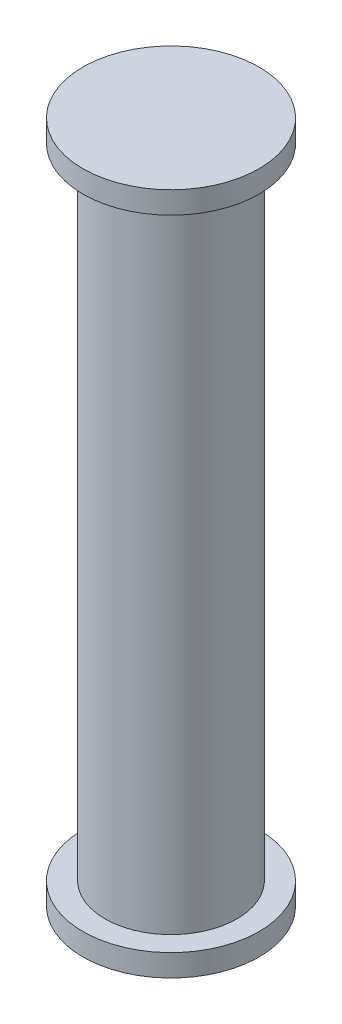
ISO-10303-21;
HEADER;
FILE_DESCRIPTION(('STEP AP214'),'2;1');
FILE_NAME('part.step','',(''),(''),'','','');
FILE_SCHEMA(('AUTOMOTIVE_DESIGN { 1 0 10303 214 1 1 1 1 }'));
ENDSEC;
DATA;
#1=APPLICATION_CONTEXT('core data for automotive mechanical design processes');
#2=APPLICATION_PROTOCOL_DEFINITION('international standard','automotive_design',2000,#1);
#3=PRODUCT_CONTEXT('',#1,'mechanical');
#4=PRODUCT('Part','Part','',(#3));
#5=PRODUCT_RELATED_PRODUCT_CATEGORY('part','',(#4));
#6=PRODUCT_DEFINITION_FORMATION('','',#4);
#7=PRODUCT_DEFINITION_CONTEXT('part definition',#1,'design');
#8=PRODUCT_DEFINITION('design','',#6,#7);
#9=PRODUCT_DEFINITION_SHAPE('','',#8);
#10=(LENGTH_UNIT() NAMED_UNIT(*) SI_UNIT(.MILLI.,.METRE.));
#11=(NAMED_UNIT(*) PLANE_ANGLE_UNIT() SI_UNIT($,.RADIAN.));
#12=(NAMED_UNIT(*) SI_UNIT($,.STERADIAN.) SOLID_ANGLE_UNIT());
#13=UNCERTAINTY_MEASURE_WITH_UNIT(LENGTH_MEASURE(1.E-05),#10,'distance_accuracy_value','');
#14=(GEOMETRIC_REPRESENTATION_CONTEXT(3) GLOBAL_UNCERTAINTY_ASSIGNED_CONTEXT((#13)) GLOBAL_UNIT_ASSIGNED_CONTEXT((#10,
#11,#12)) REPRESENTATION_CONTEXT('',''));
#15=CARTESIAN_POINT('',(0.,0.,0.));
#16=DIRECTION('',(0.,0.,1.));
#17=DIRECTION('',(1.,0.,0.));
#18=AXIS2_PLACEMENT_3D('',#15,#16,#17);
#19=CARTESIAN_POINT('',(0.,-30.,0.));
#20=DIRECTION('',(0.,1.,0.));
#21=DIRECTION('',(0.,0.,1.));
#22=AXIS2_PLACEMENT_3D('',#19,#20,#21);
#23=CYLINDRICAL_SURFACE('',#22,3.);
#24=CARTESIAN_POINT('',(0.,-30.,0.));
#25=DIRECTION('',(0.,1.,0.));
#26=DIRECTION('',(0.,0.,1.));
#27=AXIS2_PLACEMENT_3D('',#24,#25,#26);
#28=CIRCLE('',#27,3.);
#29=CARTESIAN_POINT('',(0.,-30.,3.));
#30=VERTEX_POINT('',#29);
#31=EDGE_CURVE('E52',#30,#30,#28,.T.);
#32=ORIENTED_EDGE('',*,*,#31,.T.);
#33=EDGE_LOOP('',(#32));
#34=FACE_BOUND('',#33,.T.);
#35=CARTESIAN_POINT('',(0.,-1.,0.));
#36=DIRECTION('',(0.,1.,0.));
#37=DIRECTION('',(0.,0.,1.));
#38=AXIS2_PLACEMENT_3D('',#35,#36,#37);
#39=CIRCLE('',#38,3.);
#40=CARTESIAN_POINT('',(0.,-1.,3.));
#41=VERTEX_POINT('',#40);
#42=EDGE_CURVE('E10',#41,#41,#39,.F.);
#43=ORIENTED_EDGE('',*,*,#42,.T.);
#44=EDGE_LOOP('',(#43));
#45=FACE_BOUND('',#44,.T.);
#46=ADVANCED_FACE('F37',(#34,#45),#23,.T.);
#47=CARTESIAN_POINT('',(0.,-1.,0.));
#48=DIRECTION('',(0.,1.,0.));
#49=DIRECTION('',(0.,0.,1.));
#50=AXIS2_PLACEMENT_3D('',#47,#48,#49);
#51=CYLINDRICAL_SURFACE('',#50,4.);
#52=CARTESIAN_POINT('',(0.,-1.,0.));
#53=DIRECTION('',(0.,1.,0.));
#54=DIRECTION('',(0.,0.,1.));
#55=AXIS2_PLACEMENT_3D('',#52,#53,#54);
#56=CIRCLE('',#55,4.);
#57=CARTESIAN_POINT('',(0.,-1.,4.));
#58=VERTEX_POINT('',#57);
#59=EDGE_CURVE('E43',#58,#58,#56,.T.);
#60=ORIENTED_EDGE('',*,*,#59,.T.);
#61=EDGE_LOOP('',(#60));
#62=FACE_BOUND('',#61,.T.);
#63=CARTESIAN_POINT('',(0.,0.,0.));
#64=DIRECTION('',(0.,1.,0.));
#65=DIRECTION('',(0.,0.,1.));
#66=AXIS2_PLACEMENT_3D('',#63,#64,#65);
#67=CIRCLE('',#66,4.);
#68=CARTESIAN_POINT('',(0.,0.,4.));
#69=VERTEX_POINT('',#68);
#70=EDGE_CURVE('E47',#69,#69,#67,.T.);
#71=ORIENTED_EDGE('',*,*,#70,.F.);
#72=EDGE_LOOP('',(#71));
#73=FACE_BOUND('',#72,.T.);
#74=ADVANCED_FACE('F80',(#62,#73),#51,.T.);
#75=CARTESIAN_POINT('',(0.,-1.,0.));
#76=DIRECTION('',(0.,1.,0.));
#77=DIRECTION('',(0.,0.,1.));
#78=AXIS2_PLACEMENT_3D('',#75,#76,#77);
#79=PLANE('',#78);
#80=ORIENTED_EDGE('',*,*,#42,.F.);
#81=EDGE_LOOP('',(#80));
#82=FACE_BOUND('',#81,.T.);
#83=ORIENTED_EDGE('',*,*,#59,.F.);
#84=EDGE_LOOP('',(#83));
#85=FACE_BOUND('',#84,.T.);
#86=ADVANCED_FACE('F84',(#82,#85),#79,.F.);
#87=CARTESIAN_POINT('',(0.,0.,0.));
#88=DIRECTION('',(0.,1.,0.));
#89=DIRECTION('',(0.,0.,1.));
#90=AXIS2_PLACEMENT_3D('',#87,#88,#89);
#91=PLANE('',#90);
#92=ORIENTED_EDGE('',*,*,#70,.T.);
#93=EDGE_LOOP('',(#92));
#94=FACE_BOUND('',#93,.T.);
#95=ADVANCED_FACE('F89',(#94),#91,.T.);
#96=CARTESIAN_POINT('',(0.,-31.,0.));
#97=DIRECTION('',(0.,1.,0.));
#98=DIRECTION('',(0.,0.,1.));
#99=AXIS2_PLACEMENT_3D('',#96,#97,#98);
#100=CYLINDRICAL_SURFACE('',#99,4.);
#101=CARTESIAN_POINT('',(0.,-31.,0.));
#102=DIRECTION('',(0.,-1.,0.));
#103=DIRECTION('',(0.,0.,-1.));
#104=AXIS2_PLACEMENT_3D('',#101,#102,#103);
#105=CIRCLE('',#104,4.);
#106=CARTESIAN_POINT('',(0.,-31.,-4.));
#107=VERTEX_POINT('',#106);
#108=EDGE_CURVE('E58',#107,#107,#105,.T.);
#109=ORIENTED_EDGE('',*,*,#108,.F.);
#110=EDGE_LOOP('',(#109));
#111=FACE_BOUND('',#110,.T.);
#112=CARTESIAN_POINT('',(0.,-30.,0.));
#113=DIRECTION('',(0.,-1.,0.));
#114=DIRECTION('',(0.,0.,-1.));
#115=AXIS2_PLACEMENT_3D('',#112,#113,#114);
#116=CIRCLE('',#115,4.);
#117=CARTESIAN_POINT('',(0.,-30.,-4.));
#118=VERTEX_POINT('',#117);
#119=EDGE_CURVE('E55',#118,#118,#116,.T.);
#120=ORIENTED_EDGE('',*,*,#119,.T.);
#121=EDGE_LOOP('',(#120));
#122=FACE_BOUND('',#121,.T.);
#123=ADVANCED_FACE('F67',(#111,#122),#100,.T.);
#124=CARTESIAN_POINT('',(0.,-31.,0.));
#125=DIRECTION('',(0.,-1.,0.));
#126=DIRECTION('',(0.,0.,-1.));
#127=AXIS2_PLACEMENT_3D('',#124,#125,#126);
#128=PLANE('',#127);
#129=ORIENTED_EDGE('',*,*,#108,.T.);
#130=EDGE_LOOP('',(#129));
#131=FACE_BOUND('',#130,.T.);
#132=ADVANCED_FACE('F71',(#131),#128,.T.);
#133=CARTESIAN_POINT('',(0.,-30.,0.));
#134=DIRECTION('',(0.,-1.,0.));
#135=DIRECTION('',(0.,0.,-1.));
#136=AXIS2_PLACEMENT_3D('',#133,#134,#135);
#137=PLANE('',#136);
#138=ORIENTED_EDGE('',*,*,#31,.F.);
#139=EDGE_LOOP('',(#138));
#140=FACE_BOUND('',#139,.T.);
#141=ORIENTED_EDGE('',*,*,#119,.F.);
#142=EDGE_LOOP('',(#141));
#143=FACE_BOUND('',#142,.T.);
#144=ADVANCED_FACE('F69',(#140,#143),#137,.F.);
#145=CLOSED_SHELL('',(#46,#74,#86,#95,#123,#132,#144));
#146=MANIFOLD_SOLID_BREP('B2',#145);
#147=ADVANCED_BREP_SHAPE_REPRESENTATION('',(#18,#146),#14);
#148=SHAPE_DEFINITION_REPRESENTATION(#9,#147);
ENDSEC;
END-ISO-10303-21;
